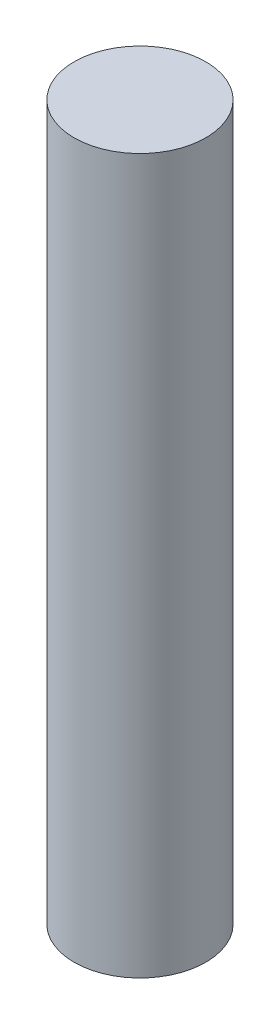
ISO-10303-21;
HEADER;
FILE_DESCRIPTION(('STEP AP214'),'2;1');
FILE_NAME('part.step','',(''),(''),'','','');
FILE_SCHEMA(('AUTOMOTIVE_DESIGN { 1 0 10303 214 1 1 1 1 }'));
ENDSEC;
DATA;
#1=APPLICATION_CONTEXT('core data for automotive mechanical design processes');
#2=APPLICATION_PROTOCOL_DEFINITION('international standard','automotive_design',2000,#1);
#3=PRODUCT_CONTEXT('',#1,'mechanical');
#4=PRODUCT('Part','Part','',(#3));
#5=PRODUCT_RELATED_PRODUCT_CATEGORY('part','',(#4));
#6=PRODUCT_DEFINITION_FORMATION('','',#4);
#7=PRODUCT_DEFINITION_CONTEXT('part definition',#1,'design');
#8=PRODUCT_DEFINITION('design','',#6,#7);
#9=PRODUCT_DEFINITION_SHAPE('','',#8);
#10=(LENGTH_UNIT() NAMED_UNIT(*) SI_UNIT(.MILLI.,.METRE.));
#11=(NAMED_UNIT(*) PLANE_ANGLE_UNIT() SI_UNIT($,.RADIAN.));
#12=(NAMED_UNIT(*) SI_UNIT($,.STERADIAN.) SOLID_ANGLE_UNIT());
#13=UNCERTAINTY_MEASURE_WITH_UNIT(LENGTH_MEASURE(1.E-05),#10,'distance_accuracy_value','');
#14=(GEOMETRIC_REPRESENTATION_CONTEXT(3) GLOBAL_UNCERTAINTY_ASSIGNED_CONTEXT((#13)) GLOBAL_UNIT_ASSIGNED_CONTEXT((#10,
#11,#12)) REPRESENTATION_CONTEXT('',''));
#15=CARTESIAN_POINT('',(0.,0.,0.));
#16=DIRECTION('',(0.,0.,1.));
#17=DIRECTION('',(1.,0.,0.));
#18=AXIS2_PLACEMENT_3D('',#15,#16,#17);
#19=CARTESIAN_POINT('',(0.,1507.5,0.));
#20=DIRECTION('',(0.,-1.,0.));
#21=DIRECTION('',(0.,0.,-1.));
#22=AXIS2_PLACEMENT_3D('',#19,#20,#21);
#23=CYLINDRICAL_SURFACE('',#22,125.);
#24=CARTESIAN_POINT('',(0.,1507.5,0.));
#25=DIRECTION('',(0.,1.,0.));
#26=DIRECTION('',(0.,0.,1.));
#27=AXIS2_PLACEMENT_3D('',#24,#25,#26);
#28=CIRCLE('',#27,125.);
#29=CARTESIAN_POINT('',(0.,1507.5,125.));
#30=VERTEX_POINT('',#29);
#31=EDGE_CURVE('E10',#30,#30,#28,.T.);
#32=ORIENTED_EDGE('',*,*,#31,.F.);
#33=EDGE_LOOP('',(#32));
#34=FACE_BOUND('',#33,.T.);
#35=CARTESIAN_POINT('',(0.,152.5,0.));
#36=DIRECTION('',(0.,1.,0.));
#37=DIRECTION('',(0.,0.,1.));
#38=AXIS2_PLACEMENT_3D('',#35,#36,#37);
#39=CIRCLE('',#38,125.);
#40=CARTESIAN_POINT('',(0.,152.5,125.));
#41=VERTEX_POINT('',#40);
#42=EDGE_CURVE('E40',#41,#41,#39,.T.);
#43=ORIENTED_EDGE('',*,*,#42,.T.);
#44=EDGE_LOOP('',(#43));
#45=FACE_BOUND('',#44,.T.);
#46=ADVANCED_FACE('F37',(#34,#45),#23,.T.);
#47=CARTESIAN_POINT('',(0.,1507.5,0.));
#48=DIRECTION('',(0.,1.,0.));
#49=DIRECTION('',(0.,0.,1.));
#50=AXIS2_PLACEMENT_3D('',#47,#48,#49);
#51=PLANE('',#50);
#52=ORIENTED_EDGE('',*,*,#31,.T.);
#53=EDGE_LOOP('',(#52));
#54=FACE_BOUND('',#53,.T.);
#55=ADVANCED_FACE('F54',(#54),#51,.T.);
#56=CARTESIAN_POINT('',(0.,152.5,0.));
#57=DIRECTION('',(0.,1.,0.));
#58=DIRECTION('',(0.,0.,1.));
#59=AXIS2_PLACEMENT_3D('',#56,#57,#58);
#60=PLANE('',#59);
#61=ORIENTED_EDGE('',*,*,#42,.F.);
#62=EDGE_LOOP('',(#61));
#63=FACE_BOUND('',#62,.T.);
#64=ADVANCED_FACE('F52',(#63),#60,.F.);
#65=CLOSED_SHELL('',(#46,#55,#64));
#66=MANIFOLD_SOLID_BREP('B2',#65);
#67=ADVANCED_BREP_SHAPE_REPRESENTATION('',(#18,#66),#14);
#68=SHAPE_DEFINITION_REPRESENTATION(#9,#67);
ENDSEC;
END-ISO-10303-21;
